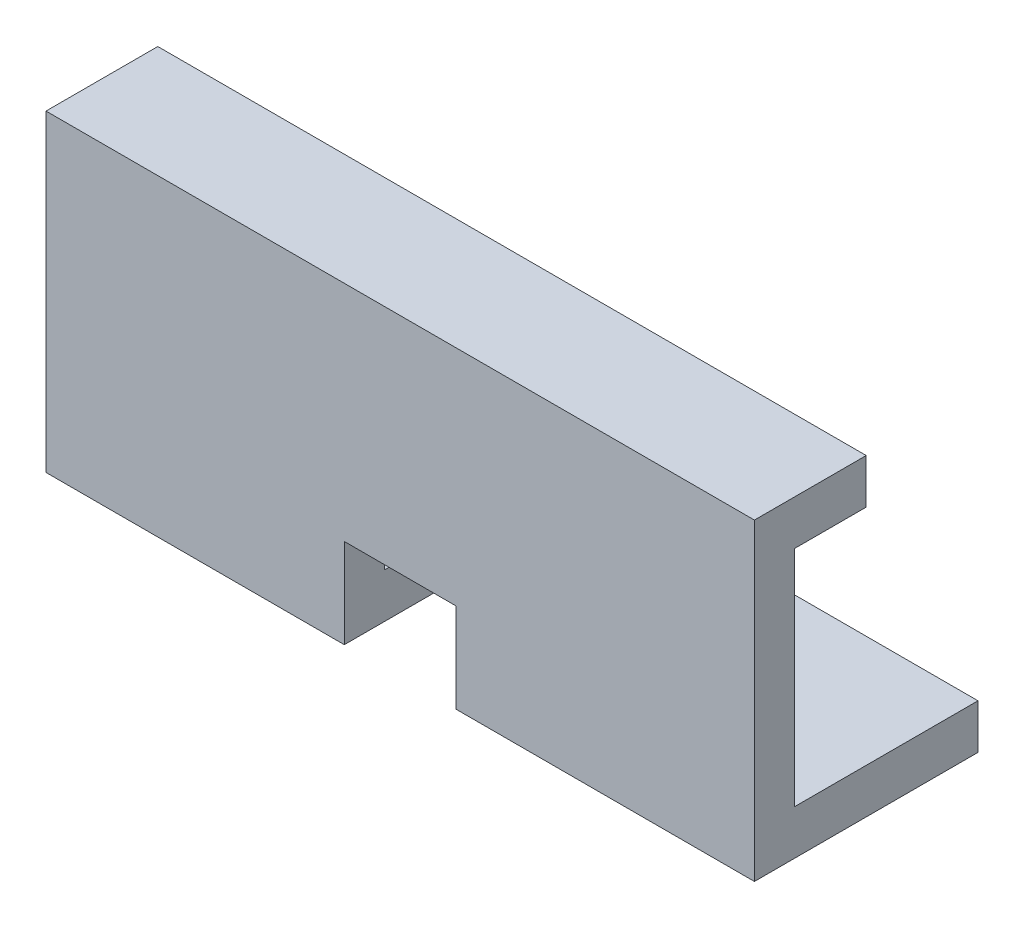
ISO-10303-21;
HEADER;
FILE_DESCRIPTION(('STEP AP214'),'2;1');
FILE_NAME('part.step','',(''),(''),'','','');
FILE_SCHEMA(('AUTOMOTIVE_DESIGN { 1 0 10303 214 1 1 1 1 }'));
ENDSEC;
DATA;
#1=APPLICATION_CONTEXT('core data for automotive mechanical design processes');
#2=APPLICATION_PROTOCOL_DEFINITION('international standard','automotive_design',2000,#1);
#3=PRODUCT_CONTEXT('',#1,'mechanical');
#4=PRODUCT('Part','Part','',(#3));
#5=PRODUCT_RELATED_PRODUCT_CATEGORY('part','',(#4));
#6=PRODUCT_DEFINITION_FORMATION('','',#4);
#7=PRODUCT_DEFINITION_CONTEXT('part definition',#1,'design');
#8=PRODUCT_DEFINITION('design','',#6,#7);
#9=PRODUCT_DEFINITION_SHAPE('','',#8);
#10=(LENGTH_UNIT() NAMED_UNIT(*) SI_UNIT(.MILLI.,.METRE.));
#11=(NAMED_UNIT(*) PLANE_ANGLE_UNIT() SI_UNIT($,.RADIAN.));
#12=(NAMED_UNIT(*) SI_UNIT($,.STERADIAN.) SOLID_ANGLE_UNIT());
#13=UNCERTAINTY_MEASURE_WITH_UNIT(LENGTH_MEASURE(1.E-05),#10,'distance_accuracy_value','');
#14=(GEOMETRIC_REPRESENTATION_CONTEXT(3) GLOBAL_UNCERTAINTY_ASSIGNED_CONTEXT((#13)) GLOBAL_UNIT_ASSIGNED_CONTEXT((#10,
#11,#12)) REPRESENTATION_CONTEXT('',''));
#15=CARTESIAN_POINT('',(0.,0.,0.));
#16=DIRECTION('',(0.,0.,1.));
#17=DIRECTION('',(1.,0.,0.));
#18=AXIS2_PLACEMENT_3D('',#15,#16,#17);
#19=CARTESIAN_POINT('',(0.,2.,0.));
#20=DIRECTION('',(0.,-1.,0.));
#21=DIRECTION('',(0.,0.,-1.));
#22=AXIS2_PLACEMENT_3D('',#19,#20,#21);
#23=PLANE('',#22);
#24=CARTESIAN_POINT('',(3.84255559230044,2.,-5.));
#25=DIRECTION('',(0.,1.,0.));
#26=DIRECTION('',(0.,0.,1.));
#27=AXIS2_PLACEMENT_3D('',#24,#25,#26);
#28=CIRCLE('',#27,1.5);
#29=CARTESIAN_POINT('',(3.84255559230044,2.,-3.5));
#30=VERTEX_POINT('',#29);
#31=EDGE_CURVE('E143',#30,#30,#28,.T.);
#32=ORIENTED_EDGE('',*,*,#31,.F.);
#33=EDGE_LOOP('',(#32));
#34=FACE_BOUND('',#33,.T.);
#35=CARTESIAN_POINT('',(17.8425555923004,2.,-5.));
#36=DIRECTION('',(0.,1.,0.));
#37=DIRECTION('',(0.,0.,1.));
#38=AXIS2_PLACEMENT_3D('',#35,#36,#37);
#39=CIRCLE('',#38,1.5);
#40=CARTESIAN_POINT('',(17.8425555923004,2.,-3.5));
#41=VERTEX_POINT('',#40);
#42=EDGE_CURVE('E236',#41,#41,#39,.T.);
#43=ORIENTED_EDGE('',*,*,#42,.F.);
#44=EDGE_LOOP('',(#43));
#45=FACE_BOUND('',#44,.T.);
#46=DIRECTION('',(0.,0.,1.));
#47=VECTOR('',#46,1.);
#48=CARTESIAN_POINT('',(8.34255559230044,2.,0.));
#49=LINE('',#48,#47);
#50=CARTESIAN_POINT('',(8.34255559230044,2.,-5.));
#51=VERTEX_POINT('',#50);
#52=CARTESIAN_POINT('',(8.34255559230044,2.,-1.8));
#53=VERTEX_POINT('',#52);
#54=EDGE_CURVE('E222',#51,#53,#49,.T.);
#55=ORIENTED_EDGE('',*,*,#54,.F.);
#56=DIRECTION('',(-1.,0.,0.));
#57=VECTOR('',#56,1.);
#58=CARTESIAN_POINT('',(0.,2.,-5.));
#59=LINE('',#58,#57);
#60=CARTESIAN_POINT('',(13.3425555923004,2.,-5.));
#61=VERTEX_POINT('',#60);
#62=EDGE_CURVE('E227',#61,#51,#59,.T.);
#63=ORIENTED_EDGE('',*,*,#62,.F.);
#64=DIRECTION('',(0.,0.,-1.));
#65=VECTOR('',#64,1.);
#66=CARTESIAN_POINT('',(13.3425555923004,2.,0.));
#67=LINE('',#66,#65);
#68=CARTESIAN_POINT('',(13.3425555923004,2.,-1.8));
#69=VERTEX_POINT('',#68);
#70=EDGE_CURVE('E218',#69,#61,#67,.T.);
#71=ORIENTED_EDGE('',*,*,#70,.F.);
#72=DIRECTION('',(-1.,0.,0.));
#73=VECTOR('',#72,1.);
#74=CARTESIAN_POINT('',(0.,2.,-1.8));
#75=LINE('',#74,#73);
#76=CARTESIAN_POINT('',(26.6851111846009,2.,-1.8));
#77=VERTEX_POINT('',#76);
#78=EDGE_CURVE('E233',#77,#69,#75,.T.);
#79=ORIENTED_EDGE('',*,*,#78,.F.);
#80=DIRECTION('',(0.,0.,1.));
#81=VECTOR('',#80,1.);
#82=CARTESIAN_POINT('',(26.6851111846009,2.,-10.));
#83=LINE('',#82,#81);
#84=CARTESIAN_POINT('',(26.6851111846009,2.,-10.));
#85=VERTEX_POINT('',#84);
#86=EDGE_CURVE('E163',#85,#77,#83,.T.);
#87=ORIENTED_EDGE('',*,*,#86,.F.);
#88=DIRECTION('',(-1.,0.,0.));
#89=VECTOR('',#88,1.);
#90=CARTESIAN_POINT('',(0.,2.,-10.));
#91=LINE('',#90,#89);
#92=CARTESIAN_POINT('',(-5.,2.,-10.));
#93=VERTEX_POINT('',#92);
#94=EDGE_CURVE('E246',#85,#93,#91,.T.);
#95=ORIENTED_EDGE('',*,*,#94,.T.);
#96=DIRECTION('',(0.,0.,-1.));
#97=VECTOR('',#96,1.);
#98=CARTESIAN_POINT('',(-5.,2.,-1.8));
#99=LINE('',#98,#97);
#100=CARTESIAN_POINT('',(-5.,2.,-1.8));
#101=VERTEX_POINT('',#100);
#102=EDGE_CURVE('E196',#101,#93,#99,.T.);
#103=ORIENTED_EDGE('',*,*,#102,.F.);
#104=EDGE_CURVE('E229',#53,#101,#75,.T.);
#105=ORIENTED_EDGE('',*,*,#104,.F.);
#106=EDGE_LOOP('',(#55,#63,#71,#79,#87,#95,#103,#105));
#107=FACE_BOUND('',#106,.T.);
#108=ADVANCED_FACE('F32',(#34,#45,#107),#23,.F.);
#109=CARTESIAN_POINT('',(0.,0.,0.));
#110=DIRECTION('',(0.,-1.,0.));
#111=DIRECTION('',(0.,0.,-1.));
#112=AXIS2_PLACEMENT_3D('',#109,#110,#111);
#113=PLANE('',#112);
#114=CARTESIAN_POINT('',(3.84255559230044,0.,-5.));
#115=DIRECTION('',(0.,1.,0.));
#116=DIRECTION('',(0.,0.,1.));
#117=AXIS2_PLACEMENT_3D('',#114,#115,#116);
#118=CIRCLE('',#117,1.5);
#119=CARTESIAN_POINT('',(3.84255559230044,0.,-3.5));
#120=VERTEX_POINT('',#119);
#121=EDGE_CURVE('E239',#120,#120,#118,.T.);
#122=ORIENTED_EDGE('',*,*,#121,.T.);
#123=EDGE_LOOP('',(#122));
#124=FACE_BOUND('',#123,.T.);
#125=CARTESIAN_POINT('',(17.8425555923004,0.,-5.));
#126=DIRECTION('',(0.,1.,0.));
#127=DIRECTION('',(0.,0.,1.));
#128=AXIS2_PLACEMENT_3D('',#125,#126,#127);
#129=CIRCLE('',#128,1.5);
#130=CARTESIAN_POINT('',(17.8425555923004,0.,-3.5));
#131=VERTEX_POINT('',#130);
#132=EDGE_CURVE('E232',#131,#131,#129,.T.);
#133=ORIENTED_EDGE('',*,*,#132,.T.);
#134=EDGE_LOOP('',(#133));
#135=FACE_BOUND('',#134,.T.);
#136=DIRECTION('',(-1.,0.,0.));
#137=VECTOR('',#136,1.);
#138=CARTESIAN_POINT('',(0.,0.,-5.));
#139=LINE('',#138,#137);
#140=CARTESIAN_POINT('',(13.3425555923004,0.,-5.));
#141=VERTEX_POINT('',#140);
#142=CARTESIAN_POINT('',(8.34255559230044,0.,-5.));
#143=VERTEX_POINT('',#142);
#144=EDGE_CURVE('E11',#141,#143,#139,.T.);
#145=ORIENTED_EDGE('',*,*,#144,.T.);
#146=DIRECTION('',(0.,0.,1.));
#147=VECTOR('',#146,1.);
#148=CARTESIAN_POINT('',(8.34255559230044,0.,0.));
#149=LINE('',#148,#147);
#150=CARTESIAN_POINT('',(8.34255559230044,0.,0.));
#151=VERTEX_POINT('',#150);
#152=EDGE_CURVE('E224',#143,#151,#149,.T.);
#153=ORIENTED_EDGE('',*,*,#152,.T.);
#154=DIRECTION('',(1.,0.,0.));
#155=VECTOR('',#154,1.);
#156=CARTESIAN_POINT('',(0.,0.,0.));
#157=LINE('',#156,#155);
#158=CARTESIAN_POINT('',(-5.,0.,0.));
#159=VERTEX_POINT('',#158);
#160=EDGE_CURVE('E142',#159,#151,#157,.T.);
#161=ORIENTED_EDGE('',*,*,#160,.F.);
#162=DIRECTION('',(0.,0.,1.));
#163=VECTOR('',#162,1.);
#164=CARTESIAN_POINT('',(-5.,0.,-10.));
#165=LINE('',#164,#163);
#166=CARTESIAN_POINT('',(-5.,0.,-10.));
#167=VERTEX_POINT('',#166);
#168=EDGE_CURVE('E178',#167,#159,#165,.T.);
#169=ORIENTED_EDGE('',*,*,#168,.F.);
#170=DIRECTION('',(-1.,0.,0.));
#171=VECTOR('',#170,1.);
#172=CARTESIAN_POINT('',(0.,0.,-10.));
#173=LINE('',#172,#171);
#174=CARTESIAN_POINT('',(26.6851111846009,0.,-10.));
#175=VERTEX_POINT('',#174);
#176=EDGE_CURVE('E149',#175,#167,#173,.T.);
#177=ORIENTED_EDGE('',*,*,#176,.F.);
#178=DIRECTION('',(0.,0.,-1.));
#179=VECTOR('',#178,1.);
#180=CARTESIAN_POINT('',(26.6851111846009,0.,0.));
#181=LINE('',#180,#179);
#182=CARTESIAN_POINT('',(26.6851111846009,0.,0.));
#183=VERTEX_POINT('',#182);
#184=EDGE_CURVE('E146',#183,#175,#181,.T.);
#185=ORIENTED_EDGE('',*,*,#184,.F.);
#186=CARTESIAN_POINT('',(13.3425555923004,0.,0.));
#187=VERTEX_POINT('',#186);
#188=EDGE_CURVE('E133',#187,#183,#157,.T.);
#189=ORIENTED_EDGE('',*,*,#188,.F.);
#190=DIRECTION('',(0.,0.,-1.));
#191=VECTOR('',#190,1.);
#192=CARTESIAN_POINT('',(13.3425555923004,0.,0.));
#193=LINE('',#192,#191);
#194=EDGE_CURVE('E220',#187,#141,#193,.T.);
#195=ORIENTED_EDGE('',*,*,#194,.T.);
#196=EDGE_LOOP('',(#145,#153,#161,#169,#177,#185,#189,#195));
#197=FACE_BOUND('',#196,.T.);
#198=ADVANCED_FACE('F147',(#124,#135,#197),#113,.T.);
#199=CARTESIAN_POINT('',(0.,2.,0.));
#200=DIRECTION('',(0.,0.,-1.));
#201=DIRECTION('',(-1.,0.,0.));
#202=AXIS2_PLACEMENT_3D('',#199,#200,#201);
#203=PLANE('',#202);
#204=DIRECTION('',(0.,-1.,0.));
#205=VECTOR('',#204,1.);
#206=CARTESIAN_POINT('',(8.34255559230044,4.,0.));
#207=LINE('',#206,#205);
#208=CARTESIAN_POINT('',(8.34255559230044,4.,0.));
#209=VERTEX_POINT('',#208);
#210=EDGE_CURVE('E216',#209,#151,#207,.T.);
#211=ORIENTED_EDGE('',*,*,#210,.F.);
#212=DIRECTION('',(1.,0.,0.));
#213=VECTOR('',#212,1.);
#214=CARTESIAN_POINT('',(8.34255559230044,4.,0.));
#215=LINE('',#214,#213);
#216=CARTESIAN_POINT('',(13.3425555923004,4.,0.));
#217=VERTEX_POINT('',#216);
#218=EDGE_CURVE('E206',#209,#217,#215,.T.);
#219=ORIENTED_EDGE('',*,*,#218,.T.);
#220=DIRECTION('',(0.,-1.,0.));
#221=VECTOR('',#220,1.);
#222=CARTESIAN_POINT('',(13.3425555923004,4.,0.));
#223=LINE('',#222,#221);
#224=EDGE_CURVE('E139',#217,#187,#223,.T.);
#225=ORIENTED_EDGE('',*,*,#224,.T.);
#226=ORIENTED_EDGE('',*,*,#188,.T.);
#227=DIRECTION('',(0.,-1.,0.));
#228=VECTOR('',#227,1.);
#229=CARTESIAN_POINT('',(26.6851111846009,14.,0.));
#230=LINE('',#229,#228);
#231=CARTESIAN_POINT('',(26.6851111846009,14.,0.));
#232=VERTEX_POINT('',#231);
#233=EDGE_CURVE('E137',#232,#183,#230,.T.);
#234=ORIENTED_EDGE('',*,*,#233,.F.);
#235=DIRECTION('',(1.,0.,0.));
#236=VECTOR('',#235,1.);
#237=CARTESIAN_POINT('',(0.,14.,0.));
#238=LINE('',#237,#236);
#239=CARTESIAN_POINT('',(-5.,14.,0.));
#240=VERTEX_POINT('',#239);
#241=EDGE_CURVE('E200',#240,#232,#238,.T.);
#242=ORIENTED_EDGE('',*,*,#241,.F.);
#243=DIRECTION('',(0.,1.,0.));
#244=VECTOR('',#243,1.);
#245=CARTESIAN_POINT('',(-5.,0.,0.));
#246=LINE('',#245,#244);
#247=EDGE_CURVE('E181',#159,#240,#246,.T.);
#248=ORIENTED_EDGE('',*,*,#247,.F.);
#249=ORIENTED_EDGE('',*,*,#160,.T.);
#250=EDGE_LOOP('',(#211,#219,#225,#226,#234,#242,#248,#249));
#251=FACE_BOUND('',#250,.T.);
#252=ADVANCED_FACE('F34',(#251),#203,.F.);
#253=CARTESIAN_POINT('',(0.,12.,-1.8));
#254=DIRECTION('',(0.,0.,1.));
#255=DIRECTION('',(1.,0.,0.));
#256=AXIS2_PLACEMENT_3D('',#253,#254,#255);
#257=PLANE('',#256);
#258=DIRECTION('',(0.,1.,0.));
#259=VECTOR('',#258,1.);
#260=CARTESIAN_POINT('',(8.34255559230044,12.,-1.8));
#261=LINE('',#260,#259);
#262=CARTESIAN_POINT('',(8.34255559230044,4.,-1.8));
#263=VERTEX_POINT('',#262);
#264=EDGE_CURVE('E40',#53,#263,#261,.T.);
#265=ORIENTED_EDGE('',*,*,#264,.F.);
#266=ORIENTED_EDGE('',*,*,#104,.T.);
#267=DIRECTION('',(0.,-1.,0.));
#268=VECTOR('',#267,1.);
#269=CARTESIAN_POINT('',(-5.,12.,-1.8));
#270=LINE('',#269,#268);
#271=CARTESIAN_POINT('',(-5.,12.,-1.8));
#272=VERTEX_POINT('',#271);
#273=EDGE_CURVE('E193',#272,#101,#270,.T.);
#274=ORIENTED_EDGE('',*,*,#273,.F.);
#275=DIRECTION('',(-1.,0.,0.));
#276=VECTOR('',#275,1.);
#277=CARTESIAN_POINT('',(0.,12.,-1.8));
#278=LINE('',#277,#276);
#279=CARTESIAN_POINT('',(26.6851111846009,12.,-1.8));
#280=VERTEX_POINT('',#279);
#281=EDGE_CURVE('E230',#280,#272,#278,.T.);
#282=ORIENTED_EDGE('',*,*,#281,.F.);
#283=DIRECTION('',(0.,1.,0.));
#284=VECTOR('',#283,1.);
#285=CARTESIAN_POINT('',(26.6851111846009,2.,-1.8));
#286=LINE('',#285,#284);
#287=EDGE_CURVE('E166',#77,#280,#286,.T.);
#288=ORIENTED_EDGE('',*,*,#287,.F.);
#289=ORIENTED_EDGE('',*,*,#78,.T.);
#290=DIRECTION('',(0.,-1.,0.));
#291=VECTOR('',#290,1.);
#292=CARTESIAN_POINT('',(13.3425555923004,12.,-1.8));
#293=LINE('',#292,#291);
#294=CARTESIAN_POINT('',(13.3425555923004,4.,-1.8));
#295=VERTEX_POINT('',#294);
#296=EDGE_CURVE('E253',#295,#69,#293,.T.);
#297=ORIENTED_EDGE('',*,*,#296,.F.);
#298=DIRECTION('',(-1.,0.,0.));
#299=VECTOR('',#298,1.);
#300=CARTESIAN_POINT('',(0.,4.,-1.8));
#301=LINE('',#300,#299);
#302=EDGE_CURVE('E247',#295,#263,#301,.T.);
#303=ORIENTED_EDGE('',*,*,#302,.T.);
#304=EDGE_LOOP('',(#265,#266,#274,#282,#288,#289,#297,#303));
#305=FACE_BOUND('',#304,.T.);
#306=ADVANCED_FACE('F262',(#305),#257,.F.);
#307=CARTESIAN_POINT('',(0.,2.,-10.));
#308=DIRECTION('',(0.,0.,1.));
#309=DIRECTION('',(1.,0.,0.));
#310=AXIS2_PLACEMENT_3D('',#307,#308,#309);
#311=PLANE('',#310);
#312=ORIENTED_EDGE('',*,*,#176,.T.);
#313=DIRECTION('',(0.,-1.,0.));
#314=VECTOR('',#313,1.);
#315=CARTESIAN_POINT('',(-5.,2.,-10.));
#316=LINE('',#315,#314);
#317=EDGE_CURVE('E175',#93,#167,#316,.T.);
#318=ORIENTED_EDGE('',*,*,#317,.F.);
#319=ORIENTED_EDGE('',*,*,#94,.F.);
#320=DIRECTION('',(0.,1.,0.));
#321=VECTOR('',#320,1.);
#322=CARTESIAN_POINT('',(26.6851111846009,0.,-10.));
#323=LINE('',#322,#321);
#324=EDGE_CURVE('E153',#175,#85,#323,.T.);
#325=ORIENTED_EDGE('',*,*,#324,.F.);
#326=EDGE_LOOP('',(#312,#318,#319,#325));
#327=FACE_BOUND('',#326,.T.);
#328=ADVANCED_FACE('F311',(#327),#311,.F.);
#329=CARTESIAN_POINT('',(3.84255559230044,2.,-5.));
#330=DIRECTION('',(0.,-1.,0.));
#331=DIRECTION('',(0.,0.,-1.));
#332=AXIS2_PLACEMENT_3D('',#329,#330,#331);
#333=CYLINDRICAL_SURFACE('',#332,1.5);
#334=ORIENTED_EDGE('',*,*,#31,.T.);
#335=EDGE_LOOP('',(#334));
#336=FACE_BOUND('',#335,.T.);
#337=ORIENTED_EDGE('',*,*,#121,.F.);
#338=EDGE_LOOP('',(#337));
#339=FACE_BOUND('',#338,.T.);
#340=ADVANCED_FACE('F309',(#336,#339),#333,.F.);
#341=CARTESIAN_POINT('',(17.8425555923004,2.,-5.));
#342=DIRECTION('',(0.,-1.,0.));
#343=DIRECTION('',(0.,0.,-1.));
#344=AXIS2_PLACEMENT_3D('',#341,#342,#343);
#345=CYLINDRICAL_SURFACE('',#344,1.5);
#346=ORIENTED_EDGE('',*,*,#42,.T.);
#347=EDGE_LOOP('',(#346));
#348=FACE_BOUND('',#347,.T.);
#349=ORIENTED_EDGE('',*,*,#132,.F.);
#350=EDGE_LOOP('',(#349));
#351=FACE_BOUND('',#350,.T.);
#352=ADVANCED_FACE('F318',(#348,#351),#345,.F.);
#353=CARTESIAN_POINT('',(8.34255559230044,4.,-5.));
#354=DIRECTION('',(0.,0.,1.));
#355=DIRECTION('',(1.,0.,0.));
#356=AXIS2_PLACEMENT_3D('',#353,#354,#355);
#357=PLANE('',#356);
#358=ORIENTED_EDGE('',*,*,#62,.T.);
#359=DIRECTION('',(0.,-1.,0.));
#360=VECTOR('',#359,1.);
#361=CARTESIAN_POINT('',(8.34255559230044,4.,-5.));
#362=LINE('',#361,#360);
#363=EDGE_CURVE('E209',#51,#143,#362,.T.);
#364=ORIENTED_EDGE('',*,*,#363,.T.);
#365=ORIENTED_EDGE('',*,*,#144,.F.);
#366=DIRECTION('',(0.,-1.,0.));
#367=VECTOR('',#366,1.);
#368=CARTESIAN_POINT('',(13.3425555923004,4.,-5.));
#369=LINE('',#368,#367);
#370=EDGE_CURVE('E212',#61,#141,#369,.T.);
#371=ORIENTED_EDGE('',*,*,#370,.F.);
#372=EDGE_LOOP('',(#358,#364,#365,#371));
#373=FACE_BOUND('',#372,.T.);
#374=ADVANCED_FACE('F270',(#373),#357,.T.);
#375=CARTESIAN_POINT('',(8.34255559230044,4.,-5.));
#376=DIRECTION('',(1.,0.,0.));
#377=DIRECTION('',(0.,0.,-1.));
#378=AXIS2_PLACEMENT_3D('',#375,#376,#377);
#379=PLANE('',#378);
#380=ORIENTED_EDGE('',*,*,#363,.F.);
#381=ORIENTED_EDGE('',*,*,#54,.T.);
#382=ORIENTED_EDGE('',*,*,#264,.T.);
#383=DIRECTION('',(0.,0.,1.));
#384=VECTOR('',#383,1.);
#385=CARTESIAN_POINT('',(8.34255559230044,4.,-5.));
#386=LINE('',#385,#384);
#387=EDGE_CURVE('E52',#263,#209,#386,.T.);
#388=ORIENTED_EDGE('',*,*,#387,.T.);
#389=ORIENTED_EDGE('',*,*,#210,.T.);
#390=ORIENTED_EDGE('',*,*,#152,.F.);
#391=EDGE_LOOP('',(#380,#381,#382,#388,#389,#390));
#392=FACE_BOUND('',#391,.T.);
#393=ADVANCED_FACE('F257',(#392),#379,.T.);
#394=CARTESIAN_POINT('',(13.3425555923004,4.,-5.));
#395=DIRECTION('',(-1.,0.,0.));
#396=DIRECTION('',(0.,0.,1.));
#397=AXIS2_PLACEMENT_3D('',#394,#395,#396);
#398=PLANE('',#397);
#399=ORIENTED_EDGE('',*,*,#224,.F.);
#400=DIRECTION('',(0.,0.,-1.));
#401=VECTOR('',#400,1.);
#402=CARTESIAN_POINT('',(13.3425555923004,4.,-5.));
#403=LINE('',#402,#401);
#404=EDGE_CURVE('E47',#217,#295,#403,.T.);
#405=ORIENTED_EDGE('',*,*,#404,.T.);
#406=ORIENTED_EDGE('',*,*,#296,.T.);
#407=ORIENTED_EDGE('',*,*,#70,.T.);
#408=ORIENTED_EDGE('',*,*,#370,.T.);
#409=ORIENTED_EDGE('',*,*,#194,.F.);
#410=EDGE_LOOP('',(#399,#405,#406,#407,#408,#409));
#411=FACE_BOUND('',#410,.T.);
#412=ADVANCED_FACE('F265',(#411),#398,.T.);
#413=CARTESIAN_POINT('',(0.,4.,0.));
#414=DIRECTION('',(0.,1.,0.));
#415=DIRECTION('',(0.,0.,1.));
#416=AXIS2_PLACEMENT_3D('',#413,#414,#415);
#417=PLANE('',#416);
#418=ORIENTED_EDGE('',*,*,#404,.F.);
#419=ORIENTED_EDGE('',*,*,#218,.F.);
#420=ORIENTED_EDGE('',*,*,#387,.F.);
#421=ORIENTED_EDGE('',*,*,#302,.F.);
#422=EDGE_LOOP('',(#418,#419,#420,#421));
#423=FACE_BOUND('',#422,.T.);
#424=ADVANCED_FACE('F263',(#423),#417,.F.);
#425=CARTESIAN_POINT('',(0.,14.,-5.));
#426=DIRECTION('',(0.,0.,1.));
#427=DIRECTION('',(1.,0.,0.));
#428=AXIS2_PLACEMENT_3D('',#425,#426,#427);
#429=PLANE('',#428);
#430=DIRECTION('',(-1.,0.,0.));
#431=VECTOR('',#430,1.);
#432=CARTESIAN_POINT('',(0.,12.,-5.));
#433=LINE('',#432,#431);
#434=CARTESIAN_POINT('',(26.6851111846009,12.,-5.));
#435=VERTEX_POINT('',#434);
#436=CARTESIAN_POINT('',(-5.,12.,-5.));
#437=VERTEX_POINT('',#436);
#438=EDGE_CURVE('E199',#435,#437,#433,.T.);
#439=ORIENTED_EDGE('',*,*,#438,.T.);
#440=DIRECTION('',(0.,-1.,0.));
#441=VECTOR('',#440,1.);
#442=CARTESIAN_POINT('',(-5.,14.,-5.));
#443=LINE('',#442,#441);
#444=CARTESIAN_POINT('',(-5.,14.,-5.));
#445=VERTEX_POINT('',#444);
#446=EDGE_CURVE('E187',#445,#437,#443,.T.);
#447=ORIENTED_EDGE('',*,*,#446,.F.);
#448=DIRECTION('',(-1.,0.,0.));
#449=VECTOR('',#448,1.);
#450=CARTESIAN_POINT('',(0.,14.,-5.));
#451=LINE('',#450,#449);
#452=CARTESIAN_POINT('',(26.6851111846009,14.,-5.));
#453=VERTEX_POINT('',#452);
#454=EDGE_CURVE('E202',#453,#445,#451,.T.);
#455=ORIENTED_EDGE('',*,*,#454,.F.);
#456=DIRECTION('',(0.,1.,0.));
#457=VECTOR('',#456,1.);
#458=CARTESIAN_POINT('',(26.6851111846009,12.,-5.));
#459=LINE('',#458,#457);
#460=EDGE_CURVE('E172',#435,#453,#459,.T.);
#461=ORIENTED_EDGE('',*,*,#460,.F.);
#462=EDGE_LOOP('',(#439,#447,#455,#461));
#463=FACE_BOUND('',#462,.T.);
#464=ADVANCED_FACE('F283',(#463),#429,.F.);
#465=CARTESIAN_POINT('',(0.,14.,0.));
#466=DIRECTION('',(0.,-1.,0.));
#467=DIRECTION('',(0.,0.,-1.));
#468=AXIS2_PLACEMENT_3D('',#465,#466,#467);
#469=PLANE('',#468);
#470=ORIENTED_EDGE('',*,*,#454,.T.);
#471=DIRECTION('',(0.,0.,-1.));
#472=VECTOR('',#471,1.);
#473=CARTESIAN_POINT('',(-5.,14.,0.));
#474=LINE('',#473,#472);
#475=EDGE_CURVE('E184',#240,#445,#474,.T.);
#476=ORIENTED_EDGE('',*,*,#475,.F.);
#477=ORIENTED_EDGE('',*,*,#241,.T.);
#478=DIRECTION('',(0.,0.,1.));
#479=VECTOR('',#478,1.);
#480=CARTESIAN_POINT('',(26.6851111846009,14.,-5.));
#481=LINE('',#480,#479);
#482=EDGE_CURVE('E159',#453,#232,#481,.T.);
#483=ORIENTED_EDGE('',*,*,#482,.F.);
#484=EDGE_LOOP('',(#470,#476,#477,#483));
#485=FACE_BOUND('',#484,.T.);
#486=ADVANCED_FACE('F288',(#485),#469,.F.);
#487=CARTESIAN_POINT('',(0.,12.,0.));
#488=DIRECTION('',(0.,-1.,0.));
#489=DIRECTION('',(0.,0.,-1.));
#490=AXIS2_PLACEMENT_3D('',#487,#488,#489);
#491=PLANE('',#490);
#492=ORIENTED_EDGE('',*,*,#438,.F.);
#493=DIRECTION('',(0.,0.,-1.));
#494=VECTOR('',#493,1.);
#495=CARTESIAN_POINT('',(26.6851111846009,12.,-1.8));
#496=LINE('',#495,#494);
#497=EDGE_CURVE('E169',#280,#435,#496,.T.);
#498=ORIENTED_EDGE('',*,*,#497,.F.);
#499=ORIENTED_EDGE('',*,*,#281,.T.);
#500=DIRECTION('',(0.,0.,1.));
#501=VECTOR('',#500,1.);
#502=CARTESIAN_POINT('',(-5.,12.,-5.));
#503=LINE('',#502,#501);
#504=EDGE_CURVE('E190',#437,#272,#503,.T.);
#505=ORIENTED_EDGE('',*,*,#504,.F.);
#506=EDGE_LOOP('',(#492,#498,#499,#505));
#507=FACE_BOUND('',#506,.T.);
#508=ADVANCED_FACE('F279',(#507),#491,.T.);
#509=CARTESIAN_POINT('',(-5.,0.,0.));
#510=DIRECTION('',(-1.,0.,0.));
#511=DIRECTION('',(0.,0.,1.));
#512=AXIS2_PLACEMENT_3D('',#509,#510,#511);
#513=PLANE('',#512);
#514=ORIENTED_EDGE('',*,*,#317,.T.);
#515=ORIENTED_EDGE('',*,*,#168,.T.);
#516=ORIENTED_EDGE('',*,*,#247,.T.);
#517=ORIENTED_EDGE('',*,*,#475,.T.);
#518=ORIENTED_EDGE('',*,*,#446,.T.);
#519=ORIENTED_EDGE('',*,*,#504,.T.);
#520=ORIENTED_EDGE('',*,*,#273,.T.);
#521=ORIENTED_EDGE('',*,*,#102,.T.);
#522=EDGE_LOOP('',(#514,#515,#516,#517,#518,#519,#520,#521));
#523=FACE_BOUND('',#522,.T.);
#524=ADVANCED_FACE('F285',(#523),#513,.T.);
#525=CARTESIAN_POINT('',(26.6851111846009,0.,0.));
#526=DIRECTION('',(1.,0.,0.));
#527=DIRECTION('',(0.,0.,-1.));
#528=AXIS2_PLACEMENT_3D('',#525,#526,#527);
#529=PLANE('',#528);
#530=ORIENTED_EDGE('',*,*,#233,.T.);
#531=ORIENTED_EDGE('',*,*,#184,.T.);
#532=ORIENTED_EDGE('',*,*,#324,.T.);
#533=ORIENTED_EDGE('',*,*,#86,.T.);
#534=ORIENTED_EDGE('',*,*,#287,.T.);
#535=ORIENTED_EDGE('',*,*,#497,.T.);
#536=ORIENTED_EDGE('',*,*,#460,.T.);
#537=ORIENTED_EDGE('',*,*,#482,.T.);
#538=EDGE_LOOP('',(#530,#531,#532,#533,#534,#535,#536,#537));
#539=FACE_BOUND('',#538,.T.);
#540=ADVANCED_FACE('F156',(#539),#529,.T.);
#541=CLOSED_SHELL('',(#108,#198,#252,#306,#328,#340,#352,#374,#393,#412,#424,#464,#486,#508,
#524,#540));
#542=MANIFOLD_SOLID_BREP('B2',#541);
#543=ADVANCED_BREP_SHAPE_REPRESENTATION('',(#18,#542),#14);
#544=SHAPE_DEFINITION_REPRESENTATION(#9,#543);
ENDSEC;
END-ISO-10303-21;
